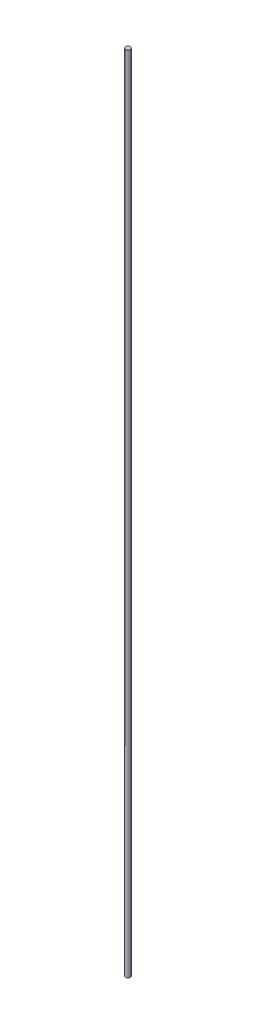
ISO-10303-21;
HEADER;
FILE_DESCRIPTION(('STEP AP214'),'2;1');
FILE_NAME('part.step','',(''),(''),'','','');
FILE_SCHEMA(('AUTOMOTIVE_DESIGN { 1 0 10303 214 1 1 1 1 }'));
ENDSEC;
DATA;
#1=APPLICATION_CONTEXT('core data for automotive mechanical design processes');
#2=APPLICATION_PROTOCOL_DEFINITION('international standard','automotive_design',2000,#1);
#3=PRODUCT_CONTEXT('',#1,'mechanical');
#4=PRODUCT('Part','Part','',(#3));
#5=PRODUCT_RELATED_PRODUCT_CATEGORY('part','',(#4));
#6=PRODUCT_DEFINITION_FORMATION('','',#4);
#7=PRODUCT_DEFINITION_CONTEXT('part definition',#1,'design');
#8=PRODUCT_DEFINITION('design','',#6,#7);
#9=PRODUCT_DEFINITION_SHAPE('','',#8);
#10=(LENGTH_UNIT() NAMED_UNIT(*) SI_UNIT(.MILLI.,.METRE.));
#11=(NAMED_UNIT(*) PLANE_ANGLE_UNIT() SI_UNIT($,.RADIAN.));
#12=(NAMED_UNIT(*) SI_UNIT($,.STERADIAN.) SOLID_ANGLE_UNIT());
#13=UNCERTAINTY_MEASURE_WITH_UNIT(LENGTH_MEASURE(1.E-05),#10,'distance_accuracy_value','');
#14=(GEOMETRIC_REPRESENTATION_CONTEXT(3) GLOBAL_UNCERTAINTY_ASSIGNED_CONTEXT((#13)) GLOBAL_UNIT_ASSIGNED_CONTEXT((#10,
#11,#12)) REPRESENTATION_CONTEXT('',''));
#15=CARTESIAN_POINT('',(0.,0.,0.));
#16=DIRECTION('',(0.,0.,1.));
#17=DIRECTION('',(1.,0.,0.));
#18=AXIS2_PLACEMENT_3D('',#15,#16,#17);
#19=CARTESIAN_POINT('',(0.,500.,0.));
#20=DIRECTION('',(0.,-1.,0.));
#21=DIRECTION('',(0.,0.,-1.));
#22=AXIS2_PLACEMENT_3D('',#19,#20,#21);
#23=CYLINDRICAL_SURFACE('',#22,1.5);
#24=CARTESIAN_POINT('',(0.,500.,0.));
#25=DIRECTION('',(0.,1.,0.));
#26=DIRECTION('',(0.,0.,1.));
#27=AXIS2_PLACEMENT_3D('',#24,#25,#26);
#28=CIRCLE('',#27,1.5);
#29=CARTESIAN_POINT('',(0.,500.,1.5));
#30=VERTEX_POINT('',#29);
#31=EDGE_CURVE('E10',#30,#30,#28,.T.);
#32=ORIENTED_EDGE('',*,*,#31,.F.);
#33=EDGE_LOOP('',(#32));
#34=FACE_BOUND('',#33,.T.);
#35=CARTESIAN_POINT('',(0.,0.,0.));
#36=DIRECTION('',(0.,1.,0.));
#37=DIRECTION('',(0.,0.,1.));
#38=AXIS2_PLACEMENT_3D('',#35,#36,#37);
#39=CIRCLE('',#38,1.5);
#40=CARTESIAN_POINT('',(0.,0.,1.5));
#41=VERTEX_POINT('',#40);
#42=EDGE_CURVE('E40',#41,#41,#39,.T.);
#43=ORIENTED_EDGE('',*,*,#42,.T.);
#44=EDGE_LOOP('',(#43));
#45=FACE_BOUND('',#44,.T.);
#46=ADVANCED_FACE('F37',(#34,#45),#23,.T.);
#47=CARTESIAN_POINT('',(0.,500.,0.));
#48=DIRECTION('',(0.,1.,0.));
#49=DIRECTION('',(0.,0.,1.));
#50=AXIS2_PLACEMENT_3D('',#47,#48,#49);
#51=PLANE('',#50);
#52=ORIENTED_EDGE('',*,*,#31,.T.);
#53=EDGE_LOOP('',(#52));
#54=FACE_BOUND('',#53,.T.);
#55=ADVANCED_FACE('F54',(#54),#51,.T.);
#56=CARTESIAN_POINT('',(0.,0.,0.));
#57=DIRECTION('',(0.,1.,0.));
#58=DIRECTION('',(0.,0.,1.));
#59=AXIS2_PLACEMENT_3D('',#56,#57,#58);
#60=PLANE('',#59);
#61=ORIENTED_EDGE('',*,*,#42,.F.);
#62=EDGE_LOOP('',(#61));
#63=FACE_BOUND('',#62,.T.);
#64=ADVANCED_FACE('F52',(#63),#60,.F.);
#65=CLOSED_SHELL('',(#46,#55,#64));
#66=MANIFOLD_SOLID_BREP('B2',#65);
#67=ADVANCED_BREP_SHAPE_REPRESENTATION('',(#18,#66),#14);
#68=SHAPE_DEFINITION_REPRESENTATION(#9,#67);
ENDSEC;
END-ISO-10303-21;
